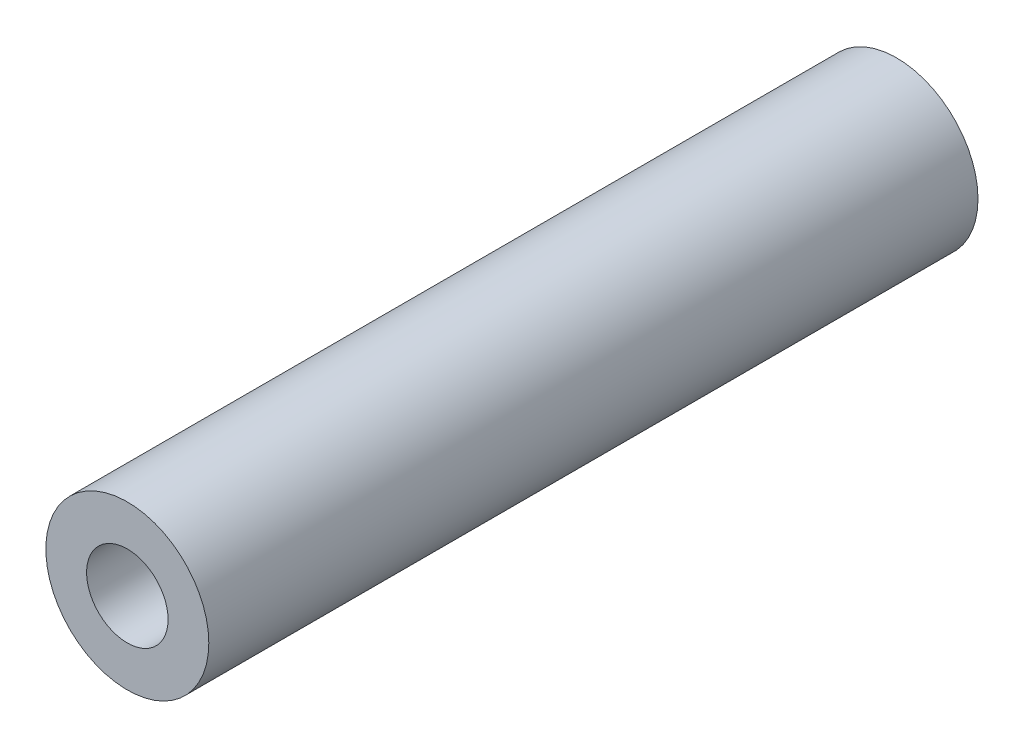
ISO-10303-21;
HEADER;
FILE_DESCRIPTION(('STEP AP214'),'2;1');
FILE_NAME('part.step','',(''),(''),'','','');
FILE_SCHEMA(('AUTOMOTIVE_DESIGN { 1 0 10303 214 1 1 1 1 }'));
ENDSEC;
DATA;
#1=APPLICATION_CONTEXT('core data for automotive mechanical design processes');
#2=APPLICATION_PROTOCOL_DEFINITION('international standard','automotive_design',2000,#1);
#3=PRODUCT_CONTEXT('',#1,'mechanical');
#4=PRODUCT('Part','Part','',(#3));
#5=PRODUCT_RELATED_PRODUCT_CATEGORY('part','',(#4));
#6=PRODUCT_DEFINITION_FORMATION('','',#4);
#7=PRODUCT_DEFINITION_CONTEXT('part definition',#1,'design');
#8=PRODUCT_DEFINITION('design','',#6,#7);
#9=PRODUCT_DEFINITION_SHAPE('','',#8);
#10=(LENGTH_UNIT() NAMED_UNIT(*) SI_UNIT(.MILLI.,.METRE.));
#11=(NAMED_UNIT(*) PLANE_ANGLE_UNIT() SI_UNIT($,.RADIAN.));
#12=(NAMED_UNIT(*) SI_UNIT($,.STERADIAN.) SOLID_ANGLE_UNIT());
#13=UNCERTAINTY_MEASURE_WITH_UNIT(LENGTH_MEASURE(1.E-05),#10,'distance_accuracy_value','');
#14=(GEOMETRIC_REPRESENTATION_CONTEXT(3) GLOBAL_UNCERTAINTY_ASSIGNED_CONTEXT((#13)) GLOBAL_UNIT_ASSIGNED_CONTEXT((#10,
#11,#12)) REPRESENTATION_CONTEXT('',''));
#15=CARTESIAN_POINT('',(0.,0.,0.));
#16=DIRECTION('',(0.,0.,1.));
#17=DIRECTION('',(1.,0.,0.));
#18=AXIS2_PLACEMENT_3D('',#15,#16,#17);
#19=CARTESIAN_POINT('',(0.,0.,5.9944));
#20=DIRECTION('',(0.,0.,1.));
#21=DIRECTION('',(1.,0.,0.));
#22=AXIS2_PLACEMENT_3D('',#19,#20,#21);
#23=PLANE('',#22);
#24=CARTESIAN_POINT('',(0.,0.,5.9944));
#25=DIRECTION('',(0.,0.,1.));
#26=DIRECTION('',(1.,0.,0.));
#27=AXIS2_PLACEMENT_3D('',#24,#25,#26);
#28=CIRCLE('',#27,0.635);
#29=CARTESIAN_POINT('',(0.635,0.,5.9944));
#30=VERTEX_POINT('',#29);
#31=EDGE_CURVE('E10',#30,#30,#28,.T.);
#32=ORIENTED_EDGE('',*,*,#31,.T.);
#33=EDGE_LOOP('',(#32));
#34=FACE_BOUND('',#33,.T.);
#35=CARTESIAN_POINT('',(0.,0.,5.9944));
#36=DIRECTION('',(0.,0.,1.));
#37=DIRECTION('',(1.,0.,0.));
#38=AXIS2_PLACEMENT_3D('',#35,#36,#37);
#39=CIRCLE('',#38,0.3175);
#40=CARTESIAN_POINT('',(0.3175,0.,5.9944));
#41=VERTEX_POINT('',#40);
#42=EDGE_CURVE('E52',#41,#41,#39,.T.);
#43=ORIENTED_EDGE('',*,*,#42,.F.);
#44=EDGE_LOOP('',(#43));
#45=FACE_BOUND('',#44,.T.);
#46=ADVANCED_FACE('F39',(#34,#45),#23,.T.);
#47=CARTESIAN_POINT('',(0.,0.,0.));
#48=DIRECTION('',(0.,0.,1.));
#49=DIRECTION('',(1.,0.,0.));
#50=AXIS2_PLACEMENT_3D('',#47,#48,#49);
#51=PLANE('',#50);
#52=CARTESIAN_POINT('',(0.,0.,0.));
#53=DIRECTION('',(0.,0.,1.));
#54=DIRECTION('',(1.,0.,0.));
#55=AXIS2_PLACEMENT_3D('',#52,#53,#54);
#56=CIRCLE('',#55,0.635);
#57=CARTESIAN_POINT('',(0.635,0.,0.));
#58=VERTEX_POINT('',#57);
#59=EDGE_CURVE('E43',#58,#58,#56,.T.);
#60=ORIENTED_EDGE('',*,*,#59,.F.);
#61=EDGE_LOOP('',(#60));
#62=FACE_BOUND('',#61,.T.);
#63=CARTESIAN_POINT('',(0.,0.,0.));
#64=DIRECTION('',(0.,0.,1.));
#65=DIRECTION('',(1.,0.,0.));
#66=AXIS2_PLACEMENT_3D('',#63,#64,#65);
#67=CIRCLE('',#66,0.3175);
#68=CARTESIAN_POINT('',(0.3175,0.,0.));
#69=VERTEX_POINT('',#68);
#70=EDGE_CURVE('E54',#69,#69,#67,.T.);
#71=ORIENTED_EDGE('',*,*,#70,.T.);
#72=EDGE_LOOP('',(#71));
#73=FACE_BOUND('',#72,.T.);
#74=ADVANCED_FACE('F66',(#62,#73),#51,.F.);
#75=CARTESIAN_POINT('',(0.,0.,5.9944));
#76=DIRECTION('',(0.,0.,-1.));
#77=DIRECTION('',(-1.,0.,0.));
#78=AXIS2_PLACEMENT_3D('',#75,#76,#77);
#79=CYLINDRICAL_SURFACE('',#78,0.635);
#80=ORIENTED_EDGE('',*,*,#31,.F.);
#81=EDGE_LOOP('',(#80));
#82=FACE_BOUND('',#81,.T.);
#83=ORIENTED_EDGE('',*,*,#59,.T.);
#84=EDGE_LOOP('',(#83));
#85=FACE_BOUND('',#84,.T.);
#86=ADVANCED_FACE('F41',(#82,#85),#79,.T.);
#87=CARTESIAN_POINT('',(0.,0.,5.9944));
#88=DIRECTION('',(0.,0.,-1.));
#89=DIRECTION('',(-1.,0.,0.));
#90=AXIS2_PLACEMENT_3D('',#87,#88,#89);
#91=CYLINDRICAL_SURFACE('',#90,0.3175);
#92=ORIENTED_EDGE('',*,*,#42,.T.);
#93=EDGE_LOOP('',(#92));
#94=FACE_BOUND('',#93,.T.);
#95=ORIENTED_EDGE('',*,*,#70,.F.);
#96=EDGE_LOOP('',(#95));
#97=FACE_BOUND('',#96,.T.);
#98=ADVANCED_FACE('F62',(#94,#97),#91,.F.);
#99=CLOSED_SHELL('',(#46,#74,#86,#98));
#100=MANIFOLD_SOLID_BREP('B2',#99);
#101=ADVANCED_BREP_SHAPE_REPRESENTATION('',(#18,#100),#14);
#102=SHAPE_DEFINITION_REPRESENTATION(#9,#101);
ENDSEC;
END-ISO-10303-21;
